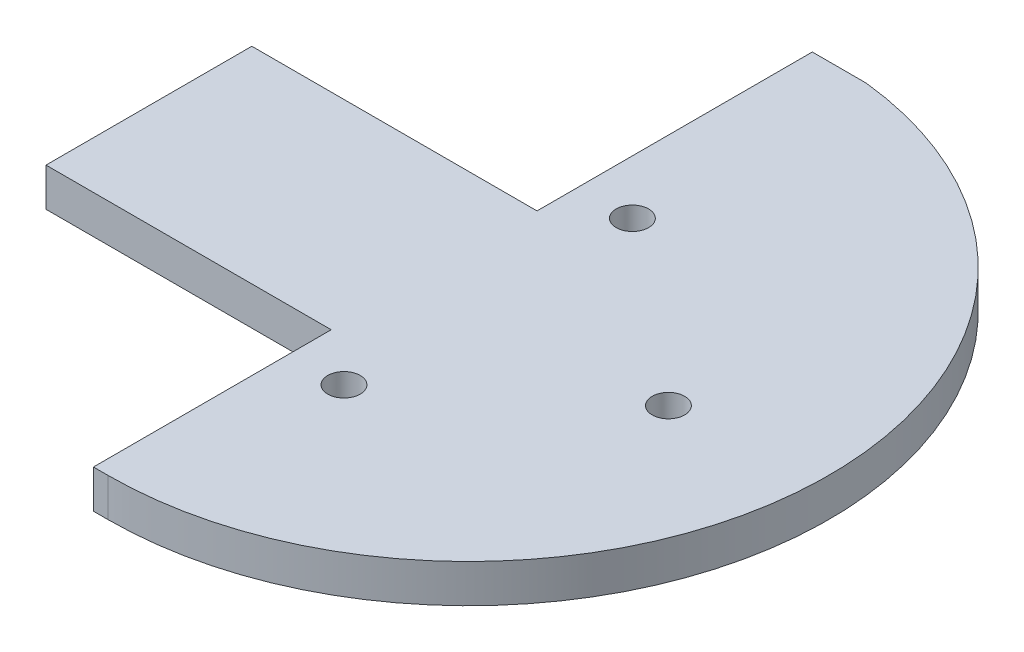
ISO-10303-21;
HEADER;
FILE_DESCRIPTION(('STEP AP214'),'2;1');
FILE_NAME('part.step','',(''),(''),'','','');
FILE_SCHEMA(('AUTOMOTIVE_DESIGN { 1 0 10303 214 1 1 1 1 }'));
ENDSEC;
DATA;
#1=APPLICATION_CONTEXT('core data for automotive mechanical design processes');
#2=APPLICATION_PROTOCOL_DEFINITION('international standard','automotive_design',2000,#1);
#3=PRODUCT_CONTEXT('',#1,'mechanical');
#4=PRODUCT('Part','Part','',(#3));
#5=PRODUCT_RELATED_PRODUCT_CATEGORY('part','',(#4));
#6=PRODUCT_DEFINITION_FORMATION('','',#4);
#7=PRODUCT_DEFINITION_CONTEXT('part definition',#1,'design');
#8=PRODUCT_DEFINITION('design','',#6,#7);
#9=PRODUCT_DEFINITION_SHAPE('','',#8);
#10=(LENGTH_UNIT() NAMED_UNIT(*) SI_UNIT(.MILLI.,.METRE.));
#11=(NAMED_UNIT(*) PLANE_ANGLE_UNIT() SI_UNIT($,.RADIAN.));
#12=(NAMED_UNIT(*) SI_UNIT($,.STERADIAN.) SOLID_ANGLE_UNIT());
#13=UNCERTAINTY_MEASURE_WITH_UNIT(LENGTH_MEASURE(1.E-05),#10,'distance_accuracy_value','');
#14=(GEOMETRIC_REPRESENTATION_CONTEXT(3) GLOBAL_UNCERTAINTY_ASSIGNED_CONTEXT((#13)) GLOBAL_UNIT_ASSIGNED_CONTEXT((#10,
#11,#12)) REPRESENTATION_CONTEXT('',''));
#15=CARTESIAN_POINT('',(0.,0.,0.));
#16=DIRECTION('',(0.,0.,1.));
#17=DIRECTION('',(1.,0.,0.));
#18=AXIS2_PLACEMENT_3D('',#15,#16,#17);
#19=CARTESIAN_POINT('',(-10.3113273390818,2.7,25.2588523972689));
#20=DIRECTION('',(0.,1.,0.));
#21=DIRECTION('',(0.,0.,1.));
#22=AXIS2_PLACEMENT_3D('',#19,#20,#21);
#23=PLANE('',#22);
#24=CARTESIAN_POINT('',(-7.5173273950818,2.7,36.8179765975519));
#25=DIRECTION('',(0.,1.,0.));
#26=DIRECTION('',(0.,0.,1.));
#27=AXIS2_PLACEMENT_3D('',#24,#25,#26);
#28=CIRCLE('',#27,1.143);
#29=CARTESIAN_POINT('',(-7.5173273950818,2.7,35.6749765975519));
#30=VERTEX_POINT('',#29);
#31=EDGE_CURVE('E182',#30,#30,#28,.T.);
#32=ORIENTED_EDGE('',*,*,#31,.F.);
#33=EDGE_LOOP('',(#32));
#34=FACE_BOUND('',#33,.T.);
#35=DIRECTION('',(0.,0.,1.));
#36=VECTOR('',#35,1.);
#37=CARTESIAN_POINT('',(-31.4213273390818,2.7,19.4071007978348));
#38=LINE('',#37,#36);
#39=CARTESIAN_POINT('',(-31.4213273390818,2.7,19.4071007978348));
#40=VERTEX_POINT('',#39);
#41=CARTESIAN_POINT('',(-31.4213273390818,2.7,33.9088523972689));
#42=VERTEX_POINT('',#41);
#43=EDGE_CURVE('E145',#40,#42,#38,.T.);
#44=ORIENTED_EDGE('',*,*,#43,.T.);
#45=DIRECTION('',(1.,0.,0.));
#46=VECTOR('',#45,1.);
#47=CARTESIAN_POINT('',(-31.4213273390818,2.7,33.9088523972689));
#48=LINE('',#47,#46);
#49=CARTESIAN_POINT('',(-11.3273273950818,2.7,33.9088523972689));
#50=VERTEX_POINT('',#49);
#51=EDGE_CURVE('E93',#42,#50,#48,.T.);
#52=ORIENTED_EDGE('',*,*,#51,.T.);
#53=DIRECTION('',(0.,0.,1.));
#54=VECTOR('',#53,1.);
#55=CARTESIAN_POINT('',(-11.3273273950818,2.7,33.9088523972689));
#56=LINE('',#55,#54);
#57=CARTESIAN_POINT('',(-11.3273273950818,2.7,50.6588523972689));
#58=VERTEX_POINT('',#57);
#59=EDGE_CURVE('E160',#50,#58,#56,.T.);
#60=ORIENTED_EDGE('',*,*,#59,.T.);
#61=DIRECTION('',(1.,0.,0.));
#62=VECTOR('',#61,1.);
#63=CARTESIAN_POINT('',(-10.3113273390818,2.7,50.6588523972689));
#64=LINE('',#63,#62);
#65=CARTESIAN_POINT('',(-10.3113273390818,2.7,50.658852397269));
#66=VERTEX_POINT('',#65);
#67=EDGE_CURVE('E173',#58,#66,#64,.T.);
#68=ORIENTED_EDGE('',*,*,#67,.T.);
#69=CARTESIAN_POINT('',(-10.3113273390818,2.7,25.2588523972689));
#70=DIRECTION('',(0.,1.,0.));
#71=DIRECTION('',(0.,0.,1.));
#72=AXIS2_PLACEMENT_3D('',#69,#70,#71);
#73=CIRCLE('',#72,25.4);
#74=CARTESIAN_POINT('',(-7.5173273950818,2.7,0.0129900766245678));
#75=VERTEX_POINT('',#74);
#76=EDGE_CURVE('E112',#66,#75,#73,.T.);
#77=ORIENTED_EDGE('',*,*,#76,.T.);
#78=DIRECTION('',(-1.,0.,0.));
#79=VECTOR('',#78,1.);
#80=CARTESIAN_POINT('',(-7.5173273950818,2.7,0.0129900766245678));
#81=LINE('',#80,#79);
#82=CARTESIAN_POINT('',(-11.3273273950818,2.7,0.0129900766245678));
#83=VERTEX_POINT('',#82);
#84=EDGE_CURVE('E106',#75,#83,#81,.T.);
#85=ORIENTED_EDGE('',*,*,#84,.T.);
#86=DIRECTION('',(0.,0.,1.));
#87=VECTOR('',#86,1.);
#88=CARTESIAN_POINT('',(-11.3273273950818,2.7,0.0129900766245678));
#89=LINE('',#88,#87);
#90=CARTESIAN_POINT('',(-11.3273273950818,2.7,19.4071007978348));
#91=VERTEX_POINT('',#90);
#92=EDGE_CURVE('E110',#83,#91,#89,.T.);
#93=ORIENTED_EDGE('',*,*,#92,.T.);
#94=DIRECTION('',(-1.,0.,0.));
#95=VECTOR('',#94,1.);
#96=CARTESIAN_POINT('',(-31.4213273390818,2.7,19.4071007978348));
#97=LINE('',#96,#95);
#98=EDGE_CURVE('E50',#91,#40,#97,.T.);
#99=ORIENTED_EDGE('',*,*,#98,.T.);
#100=EDGE_LOOP('',(#44,#52,#60,#68,#77,#85,#93,#99));
#101=FACE_BOUND('',#100,.T.);
#102=CARTESIAN_POINT('',(-7.5173273950818,2.7,16.4979765975519));
#103=DIRECTION('',(0.,1.,0.));
#104=DIRECTION('',(0.,0.,1.));
#105=AXIS2_PLACEMENT_3D('',#102,#103,#104);
#106=CIRCLE('',#105,1.143);
#107=CARTESIAN_POINT('',(-7.5173273950818,2.7,15.3549765975519));
#108=VERTEX_POINT('',#107);
#109=EDGE_CURVE('E134',#108,#108,#106,.T.);
#110=ORIENTED_EDGE('',*,*,#109,.F.);
#111=EDGE_LOOP('',(#110));
#112=FACE_BOUND('',#111,.T.);
#113=CARTESIAN_POINT('',(5.1826726049182,2.7,26.6579765975519));
#114=DIRECTION('',(0.,1.,0.));
#115=DIRECTION('',(0.,0.,1.));
#116=AXIS2_PLACEMENT_3D('',#113,#114,#115);
#117=CIRCLE('',#116,1.143);
#118=CARTESIAN_POINT('',(5.1826726049182,2.7,25.5149765975519));
#119=VERTEX_POINT('',#118);
#120=EDGE_CURVE('E188',#119,#119,#117,.T.);
#121=ORIENTED_EDGE('',*,*,#120,.F.);
#122=EDGE_LOOP('',(#121));
#123=FACE_BOUND('',#122,.T.);
#124=ADVANCED_FACE('F33',(#34,#101,#112,#123),#23,.T.);
#125=CARTESIAN_POINT('',(-10.3113273390818,0.,25.2588523972689));
#126=DIRECTION('',(0.,1.,0.));
#127=DIRECTION('',(0.,0.,1.));
#128=AXIS2_PLACEMENT_3D('',#125,#126,#127);
#129=PLANE('',#128);
#130=CARTESIAN_POINT('',(-7.5173273950818,0.,36.8179765975519));
#131=DIRECTION('',(0.,1.,0.));
#132=DIRECTION('',(0.,0.,1.));
#133=AXIS2_PLACEMENT_3D('',#130,#131,#132);
#134=CIRCLE('',#133,1.143);
#135=CARTESIAN_POINT('',(-7.5173273950818,0.,35.6749765975519));
#136=VERTEX_POINT('',#135);
#137=EDGE_CURVE('E185',#136,#136,#134,.T.);
#138=ORIENTED_EDGE('',*,*,#137,.T.);
#139=EDGE_LOOP('',(#138));
#140=FACE_BOUND('',#139,.T.);
#141=DIRECTION('',(0.,0.,1.));
#142=VECTOR('',#141,1.);
#143=CARTESIAN_POINT('',(-31.4213273390818,0.,19.4071007978348));
#144=LINE('',#143,#142);
#145=CARTESIAN_POINT('',(-31.4213273390818,0.,19.4071007978348));
#146=VERTEX_POINT('',#145);
#147=CARTESIAN_POINT('',(-31.4213273390818,0.,33.9088523972689));
#148=VERTEX_POINT('',#147);
#149=EDGE_CURVE('E130',#146,#148,#144,.T.);
#150=ORIENTED_EDGE('',*,*,#149,.F.);
#151=DIRECTION('',(-1.,0.,0.));
#152=VECTOR('',#151,1.);
#153=CARTESIAN_POINT('',(-31.4213273390818,0.,19.4071007978348));
#154=LINE('',#153,#152);
#155=CARTESIAN_POINT('',(-11.3273273950818,0.,19.4071007978348));
#156=VERTEX_POINT('',#155);
#157=EDGE_CURVE('E85',#156,#146,#154,.T.);
#158=ORIENTED_EDGE('',*,*,#157,.F.);
#159=DIRECTION('',(0.,0.,1.));
#160=VECTOR('',#159,1.);
#161=CARTESIAN_POINT('',(-11.3273273950818,0.,0.0129900766245678));
#162=LINE('',#161,#160);
#163=CARTESIAN_POINT('',(-11.3273273950818,0.,0.0129900766245678));
#164=VERTEX_POINT('',#163);
#165=EDGE_CURVE('E79',#164,#156,#162,.T.);
#166=ORIENTED_EDGE('',*,*,#165,.F.);
#167=DIRECTION('',(-1.,0.,0.));
#168=VECTOR('',#167,1.);
#169=CARTESIAN_POINT('',(-7.5173273950818,0.,0.0129900766245678));
#170=LINE('',#169,#168);
#171=CARTESIAN_POINT('',(-7.5173273950818,0.,0.0129900766245678));
#172=VERTEX_POINT('',#171);
#173=EDGE_CURVE('E120',#172,#164,#170,.T.);
#174=ORIENTED_EDGE('',*,*,#173,.F.);
#175=CARTESIAN_POINT('',(-10.3113273390818,0.,25.2588523972689));
#176=DIRECTION('',(0.,1.,0.));
#177=DIRECTION('',(0.,0.,1.));
#178=AXIS2_PLACEMENT_3D('',#175,#176,#177);
#179=CIRCLE('',#178,25.4);
#180=CARTESIAN_POINT('',(-10.3113273390818,0.,50.658852397269));
#181=VERTEX_POINT('',#180);
#182=EDGE_CURVE('E140',#181,#172,#179,.T.);
#183=ORIENTED_EDGE('',*,*,#182,.F.);
#184=DIRECTION('',(1.,0.,0.));
#185=VECTOR('',#184,1.);
#186=CARTESIAN_POINT('',(-10.3113273390818,0.,50.6588523972689));
#187=LINE('',#186,#185);
#188=CARTESIAN_POINT('',(-11.3273273950818,0.,50.6588523972689));
#189=VERTEX_POINT('',#188);
#190=EDGE_CURVE('E138',#189,#181,#187,.T.);
#191=ORIENTED_EDGE('',*,*,#190,.F.);
#192=DIRECTION('',(0.,0.,1.));
#193=VECTOR('',#192,1.);
#194=CARTESIAN_POINT('',(-11.3273273950818,0.,33.9088523972689));
#195=LINE('',#194,#193);
#196=CARTESIAN_POINT('',(-11.3273273950818,0.,33.9088523972689));
#197=VERTEX_POINT('',#196);
#198=EDGE_CURVE('E136',#197,#189,#195,.T.);
#199=ORIENTED_EDGE('',*,*,#198,.F.);
#200=DIRECTION('',(1.,0.,0.));
#201=VECTOR('',#200,1.);
#202=CARTESIAN_POINT('',(-31.4213273390818,0.,33.9088523972689));
#203=LINE('',#202,#201);
#204=EDGE_CURVE('E133',#148,#197,#203,.T.);
#205=ORIENTED_EDGE('',*,*,#204,.F.);
#206=EDGE_LOOP('',(#150,#158,#166,#174,#183,#191,#199,#205));
#207=FACE_BOUND('',#206,.T.);
#208=CARTESIAN_POINT('',(-7.5173273950818,0.,16.4979765975519));
#209=DIRECTION('',(0.,1.,0.));
#210=DIRECTION('',(0.,0.,1.));
#211=AXIS2_PLACEMENT_3D('',#208,#209,#210);
#212=CIRCLE('',#211,1.143);
#213=CARTESIAN_POINT('',(-7.5173273950818,0.,15.3549765975519));
#214=VERTEX_POINT('',#213);
#215=EDGE_CURVE('E179',#214,#214,#212,.T.);
#216=ORIENTED_EDGE('',*,*,#215,.T.);
#217=EDGE_LOOP('',(#216));
#218=FACE_BOUND('',#217,.T.);
#219=CARTESIAN_POINT('',(5.1826726049182,0.,26.6579765975519));
#220=DIRECTION('',(0.,1.,0.));
#221=DIRECTION('',(0.,0.,1.));
#222=AXIS2_PLACEMENT_3D('',#219,#220,#221);
#223=CIRCLE('',#222,1.143);
#224=CARTESIAN_POINT('',(5.1826726049182,0.,25.5149765975519));
#225=VERTEX_POINT('',#224);
#226=EDGE_CURVE('E191',#225,#225,#223,.T.);
#227=ORIENTED_EDGE('',*,*,#226,.T.);
#228=EDGE_LOOP('',(#227));
#229=FACE_BOUND('',#228,.T.);
#230=ADVANCED_FACE('F164',(#140,#207,#218,#229),#129,.F.);
#231=CARTESIAN_POINT('',(-31.4213273390818,2.7,19.4071007978348));
#232=DIRECTION('',(1.,0.,0.));
#233=DIRECTION('',(0.,0.,-1.));
#234=AXIS2_PLACEMENT_3D('',#231,#232,#233);
#235=PLANE('',#234);
#236=ORIENTED_EDGE('',*,*,#149,.T.);
#237=DIRECTION('',(0.,-1.,0.));
#238=VECTOR('',#237,1.);
#239=CARTESIAN_POINT('',(-31.4213273390818,2.7,33.9088523972689));
#240=LINE('',#239,#238);
#241=EDGE_CURVE('E11',#42,#148,#240,.T.);
#242=ORIENTED_EDGE('',*,*,#241,.F.);
#243=ORIENTED_EDGE('',*,*,#43,.F.);
#244=DIRECTION('',(0.,-1.,0.));
#245=VECTOR('',#244,1.);
#246=CARTESIAN_POINT('',(-31.4213273390818,2.7,19.4071007978348));
#247=LINE('',#246,#245);
#248=EDGE_CURVE('E126',#40,#146,#247,.T.);
#249=ORIENTED_EDGE('',*,*,#248,.T.);
#250=EDGE_LOOP('',(#236,#242,#243,#249));
#251=FACE_BOUND('',#250,.T.);
#252=ADVANCED_FACE('F35',(#251),#235,.F.);
#253=CARTESIAN_POINT('',(-31.4213273390818,2.7,33.9088523972689));
#254=DIRECTION('',(0.,0.,-1.));
#255=DIRECTION('',(-1.,0.,0.));
#256=AXIS2_PLACEMENT_3D('',#253,#254,#255);
#257=PLANE('',#256);
#258=ORIENTED_EDGE('',*,*,#204,.T.);
#259=DIRECTION('',(0.,-1.,0.));
#260=VECTOR('',#259,1.);
#261=CARTESIAN_POINT('',(-11.3273273950818,2.7,33.9088523972689));
#262=LINE('',#261,#260);
#263=EDGE_CURVE('E42',#50,#197,#262,.T.);
#264=ORIENTED_EDGE('',*,*,#263,.F.);
#265=ORIENTED_EDGE('',*,*,#51,.F.);
#266=ORIENTED_EDGE('',*,*,#241,.T.);
#267=EDGE_LOOP('',(#258,#264,#265,#266));
#268=FACE_BOUND('',#267,.T.);
#269=ADVANCED_FACE('F225',(#268),#257,.F.);
#270=CARTESIAN_POINT('',(-11.3273273950818,2.7,33.9088523972689));
#271=DIRECTION('',(1.,0.,0.));
#272=DIRECTION('',(0.,0.,-1.));
#273=AXIS2_PLACEMENT_3D('',#270,#271,#272);
#274=PLANE('',#273);
#275=ORIENTED_EDGE('',*,*,#198,.T.);
#276=DIRECTION('',(0.,-1.,0.));
#277=VECTOR('',#276,1.);
#278=CARTESIAN_POINT('',(-11.3273273950818,2.7,50.6588523972689));
#279=LINE('',#278,#277);
#280=EDGE_CURVE('E152',#58,#189,#279,.T.);
#281=ORIENTED_EDGE('',*,*,#280,.F.);
#282=ORIENTED_EDGE('',*,*,#59,.F.);
#283=ORIENTED_EDGE('',*,*,#263,.T.);
#284=EDGE_LOOP('',(#275,#281,#282,#283));
#285=FACE_BOUND('',#284,.T.);
#286=ADVANCED_FACE('F158',(#285),#274,.F.);
#287=CARTESIAN_POINT('',(-10.3113273390818,2.7,50.6588523972689));
#288=DIRECTION('',(0.,0.,-1.));
#289=DIRECTION('',(-1.,0.,0.));
#290=AXIS2_PLACEMENT_3D('',#287,#288,#289);
#291=PLANE('',#290);
#292=ORIENTED_EDGE('',*,*,#190,.T.);
#293=DIRECTION('',(0.,-1.,0.));
#294=VECTOR('',#293,1.);
#295=CARTESIAN_POINT('',(-10.3113273390818,2.7,50.658852397269));
#296=LINE('',#295,#294);
#297=EDGE_CURVE('E149',#66,#181,#296,.T.);
#298=ORIENTED_EDGE('',*,*,#297,.F.);
#299=ORIENTED_EDGE('',*,*,#67,.F.);
#300=ORIENTED_EDGE('',*,*,#280,.T.);
#301=EDGE_LOOP('',(#292,#298,#299,#300));
#302=FACE_BOUND('',#301,.T.);
#303=ADVANCED_FACE('F169',(#302),#291,.F.);
#304=CARTESIAN_POINT('',(-10.3113273390818,2.7,25.2588523972689));
#305=DIRECTION('',(0.,-1.,0.));
#306=DIRECTION('',(0.,0.,-1.));
#307=AXIS2_PLACEMENT_3D('',#304,#305,#306);
#308=CYLINDRICAL_SURFACE('',#307,25.4);
#309=ORIENTED_EDGE('',*,*,#182,.T.);
#310=DIRECTION('',(0.,-1.,0.));
#311=VECTOR('',#310,1.);
#312=CARTESIAN_POINT('',(-7.5173273950818,2.7,0.0129900766245678));
#313=LINE('',#312,#311);
#314=EDGE_CURVE('E121',#75,#172,#313,.T.);
#315=ORIENTED_EDGE('',*,*,#314,.F.);
#316=ORIENTED_EDGE('',*,*,#76,.F.);
#317=ORIENTED_EDGE('',*,*,#297,.T.);
#318=EDGE_LOOP('',(#309,#315,#316,#317));
#319=FACE_BOUND('',#318,.T.);
#320=ADVANCED_FACE('F172',(#319),#308,.T.);
#321=CARTESIAN_POINT('',(-7.5173273950818,2.7,0.0129900766245678));
#322=DIRECTION('',(0.,0.,1.));
#323=DIRECTION('',(1.,0.,0.));
#324=AXIS2_PLACEMENT_3D('',#321,#322,#323);
#325=PLANE('',#324);
#326=ORIENTED_EDGE('',*,*,#173,.T.);
#327=DIRECTION('',(0.,-1.,0.));
#328=VECTOR('',#327,1.);
#329=CARTESIAN_POINT('',(-11.3273273950818,2.7,0.0129900766245678));
#330=LINE('',#329,#328);
#331=EDGE_CURVE('E117',#83,#164,#330,.T.);
#332=ORIENTED_EDGE('',*,*,#331,.F.);
#333=ORIENTED_EDGE('',*,*,#84,.F.);
#334=ORIENTED_EDGE('',*,*,#314,.T.);
#335=EDGE_LOOP('',(#326,#332,#333,#334));
#336=FACE_BOUND('',#335,.T.);
#337=ADVANCED_FACE('F118',(#336),#325,.F.);
#338=CARTESIAN_POINT('',(-11.3273273950818,2.7,0.0129900766245678));
#339=DIRECTION('',(1.,0.,0.));
#340=DIRECTION('',(0.,0.,-1.));
#341=AXIS2_PLACEMENT_3D('',#338,#339,#340);
#342=PLANE('',#341);
#343=ORIENTED_EDGE('',*,*,#165,.T.);
#344=DIRECTION('',(0.,-1.,0.));
#345=VECTOR('',#344,1.);
#346=CARTESIAN_POINT('',(-11.3273273950818,2.7,19.4071007978348));
#347=LINE('',#346,#345);
#348=EDGE_CURVE('E122',#91,#156,#347,.T.);
#349=ORIENTED_EDGE('',*,*,#348,.F.);
#350=ORIENTED_EDGE('',*,*,#92,.F.);
#351=ORIENTED_EDGE('',*,*,#331,.T.);
#352=EDGE_LOOP('',(#343,#349,#350,#351));
#353=FACE_BOUND('',#352,.T.);
#354=ADVANCED_FACE('F124',(#353),#342,.F.);
#355=CARTESIAN_POINT('',(-31.4213273390818,2.7,19.4071007978348));
#356=DIRECTION('',(0.,0.,1.));
#357=DIRECTION('',(1.,0.,0.));
#358=AXIS2_PLACEMENT_3D('',#355,#356,#357);
#359=PLANE('',#358);
#360=ORIENTED_EDGE('',*,*,#157,.T.);
#361=ORIENTED_EDGE('',*,*,#248,.F.);
#362=ORIENTED_EDGE('',*,*,#98,.F.);
#363=ORIENTED_EDGE('',*,*,#348,.T.);
#364=EDGE_LOOP('',(#360,#361,#362,#363));
#365=FACE_BOUND('',#364,.T.);
#366=ADVANCED_FACE('F213',(#365),#359,.F.);
#367=CARTESIAN_POINT('',(-7.5173273950818,2.7,16.4979765975519));
#368=DIRECTION('',(0.,-1.,0.));
#369=DIRECTION('',(0.,0.,-1.));
#370=AXIS2_PLACEMENT_3D('',#367,#368,#369);
#371=CYLINDRICAL_SURFACE('',#370,1.143);
#372=CARTESIAN_POINT('',(-7.5173273950818,2.7,15.3549765975519));
#373=CARTESIAN_POINT('',(-7.5173273950818,2.671875,15.3549765975519));
#374=CARTESIAN_POINT('',(-7.5173273950818,2.64375,15.3549765975519));
#375=CARTESIAN_POINT('',(-7.5173273950818,2.5875,15.3549765975519));
#376=CARTESIAN_POINT('',(-7.5173273950818,2.559375,15.3549765975519));
#377=CARTESIAN_POINT('',(-7.5173273950818,2.503125,15.3549765975519));
#378=CARTESIAN_POINT('',(-7.5173273950818,2.475,15.3549765975519));
#379=CARTESIAN_POINT('',(-7.5173273950818,2.41875,15.3549765975519));
#380=CARTESIAN_POINT('',(-7.5173273950818,2.390625,15.3549765975519));
#381=CARTESIAN_POINT('',(-7.5173273950818,2.334375,15.3549765975519));
#382=CARTESIAN_POINT('',(-7.5173273950818,2.30625,15.3549765975519));
#383=CARTESIAN_POINT('',(-7.5173273950818,2.25,15.3549765975519));
#384=CARTESIAN_POINT('',(-7.5173273950818,2.221875,15.3549765975519));
#385=CARTESIAN_POINT('',(-7.5173273950818,2.165625,15.3549765975519));
#386=CARTESIAN_POINT('',(-7.5173273950818,2.1375,15.3549765975519));
#387=CARTESIAN_POINT('',(-7.5173273950818,2.08125,15.3549765975519));
#388=CARTESIAN_POINT('',(-7.5173273950818,2.053125,15.3549765975519));
#389=CARTESIAN_POINT('',(-7.5173273950818,1.996875,15.3549765975519));
#390=CARTESIAN_POINT('',(-7.5173273950818,1.96875,15.3549765975519));
#391=CARTESIAN_POINT('',(-7.5173273950818,1.9125,15.3549765975519));
#392=CARTESIAN_POINT('',(-7.5173273950818,1.884375,15.3549765975519));
#393=CARTESIAN_POINT('',(-7.5173273950818,1.828125,15.3549765975519));
#394=CARTESIAN_POINT('',(-7.5173273950818,1.8,15.3549765975519));
#395=CARTESIAN_POINT('',(-7.5173273950818,1.74375,15.3549765975519));
#396=CARTESIAN_POINT('',(-7.5173273950818,1.715625,15.3549765975519));
#397=CARTESIAN_POINT('',(-7.5173273950818,1.659375,15.3549765975519));
#398=CARTESIAN_POINT('',(-7.5173273950818,1.63125,15.3549765975519));
#399=CARTESIAN_POINT('',(-7.5173273950818,1.575,15.3549765975519));
#400=CARTESIAN_POINT('',(-7.5173273950818,1.546875,15.3549765975519));
#401=CARTESIAN_POINT('',(-7.5173273950818,1.490625,15.3549765975519));
#402=CARTESIAN_POINT('',(-7.5173273950818,1.4625,15.3549765975519));
#403=CARTESIAN_POINT('',(-7.5173273950818,1.40625,15.3549765975519));
#404=CARTESIAN_POINT('',(-7.5173273950818,1.378125,15.3549765975519));
#405=CARTESIAN_POINT('',(-7.5173273950818,1.321875,15.3549765975519));
#406=CARTESIAN_POINT('',(-7.5173273950818,1.29375,15.3549765975519));
#407=CARTESIAN_POINT('',(-7.5173273950818,1.2375,15.3549765975519));
#408=CARTESIAN_POINT('',(-7.5173273950818,1.209375,15.3549765975519));
#409=CARTESIAN_POINT('',(-7.5173273950818,1.153125,15.3549765975519));
#410=CARTESIAN_POINT('',(-7.5173273950818,1.125,15.3549765975519));
#411=CARTESIAN_POINT('',(-7.5173273950818,1.06875,15.3549765975519));
#412=CARTESIAN_POINT('',(-7.5173273950818,1.040625,15.3549765975519));
#413=CARTESIAN_POINT('',(-7.5173273950818,0.984375,15.3549765975519));
#414=CARTESIAN_POINT('',(-7.5173273950818,0.956249999999999,15.3549765975519));
#415=CARTESIAN_POINT('',(-7.5173273950818,0.899999999999999,15.3549765975519));
#416=CARTESIAN_POINT('',(-7.5173273950818,0.871875,15.3549765975519));
#417=CARTESIAN_POINT('',(-7.5173273950818,0.815624999999999,15.3549765975519));
#418=CARTESIAN_POINT('',(-7.5173273950818,0.787499999999999,15.3549765975519));
#419=CARTESIAN_POINT('',(-7.5173273950818,0.73125,15.3549765975519));
#420=CARTESIAN_POINT('',(-7.5173273950818,0.703125,15.3549765975519));
#421=CARTESIAN_POINT('',(-7.5173273950818,0.646875,15.3549765975519));
#422=CARTESIAN_POINT('',(-7.5173273950818,0.61875,15.3549765975519));
#423=CARTESIAN_POINT('',(-7.5173273950818,0.5625,15.3549765975519));
#424=CARTESIAN_POINT('',(-7.5173273950818,0.534375,15.3549765975519));
#425=CARTESIAN_POINT('',(-7.5173273950818,0.478125,15.3549765975519));
#426=CARTESIAN_POINT('',(-7.5173273950818,0.45,15.3549765975519));
#427=CARTESIAN_POINT('',(-7.5173273950818,0.39375,15.3549765975519));
#428=CARTESIAN_POINT('',(-7.5173273950818,0.365625,15.3549765975519));
#429=CARTESIAN_POINT('',(-7.5173273950818,0.309375,15.3549765975519));
#430=CARTESIAN_POINT('',(-7.5173273950818,0.28125,15.3549765975519));
#431=CARTESIAN_POINT('',(-7.5173273950818,0.225,15.3549765975519));
#432=CARTESIAN_POINT('',(-7.5173273950818,0.196875,15.3549765975519));
#433=CARTESIAN_POINT('',(-7.5173273950818,0.140625,15.3549765975519));
#434=CARTESIAN_POINT('',(-7.5173273950818,0.1125,15.3549765975519));
#435=CARTESIAN_POINT('',(-7.5173273950818,0.0562499999999997,15.3549765975519));
#436=CARTESIAN_POINT('',(-7.5173273950818,0.0281249999999996,15.3549765975519));
#437=CARTESIAN_POINT('',(-7.5173273950818,0.,15.3549765975519));
#438=B_SPLINE_CURVE_WITH_KNOTS('',3,(#372,#373,#374,#375,#376,#377,#378,#379,#380,#381,#382,
#383,#384,#385,#386,#387,#388,#389,#390,#391,#392,#393,#394,#395,#396,#397,#398,#399,#400,#401,
#402,#403,#404,#405,#406,#407,#408,#409,#410,#411,#412,#413,#414,#415,#416,#417,#418,#419,#420,
#421,#422,#423,#424,#425,#426,#427,#428,#429,#430,#431,#432,#433,#434,#435,#436,#437),
.UNSPECIFIED.,.F.,.F.,(4,2,2,2,2,2,2,2,2,2,2,2,2,2,2,2,2,2,2,2,2,2,2,2,2,2,2,2,2,2,2,2,4),(0.,
0.0843750000000003,0.16875,0.253125,0.3375,0.421875,0.50625,0.590625,0.675,0.759375,0.84375,
0.928125000000001,1.0125,1.096875,1.18125,1.265625,1.35,1.434375,1.51875,1.603125,1.6875,
1.771875,1.85625,1.940625,2.025,2.109375,2.19375,2.278125,2.3625,2.446875,2.53125,2.615625,2.7),.UNSPECIFIED.);
#439=EDGE_CURVE('BSEAM210',#108,#214,#438,.T.);
#440=ORIENTED_EDGE('',*,*,#109,.T.);
#441=ORIENTED_EDGE('',*,*,#215,.F.);
#442=ORIENTED_EDGE('',*,*,#439,.T.);
#443=ORIENTED_EDGE('',*,*,#439,.F.);
#444=EDGE_LOOP('',(#440,#442,#441,#443));
#445=FACE_BOUND('',#444,.T.);
#446=ADVANCED_FACE('F210',(#445),#371,.F.);
#447=CARTESIAN_POINT('',(-7.5173273950818,2.7,36.8179765975519));
#448=DIRECTION('',(0.,-1.,0.));
#449=DIRECTION('',(0.,0.,-1.));
#450=AXIS2_PLACEMENT_3D('',#447,#448,#449);
#451=CYLINDRICAL_SURFACE('',#450,1.143);
#452=CARTESIAN_POINT('',(-7.5173273950818,2.7,35.6749765975519));
#453=CARTESIAN_POINT('',(-7.5173273950818,2.671875,35.6749765975519));
#454=CARTESIAN_POINT('',(-7.5173273950818,2.64375,35.6749765975519));
#455=CARTESIAN_POINT('',(-7.5173273950818,2.5875,35.6749765975519));
#456=CARTESIAN_POINT('',(-7.5173273950818,2.559375,35.6749765975519));
#457=CARTESIAN_POINT('',(-7.5173273950818,2.503125,35.6749765975519));
#458=CARTESIAN_POINT('',(-7.5173273950818,2.475,35.6749765975519));
#459=CARTESIAN_POINT('',(-7.5173273950818,2.41875,35.6749765975519));
#460=CARTESIAN_POINT('',(-7.5173273950818,2.390625,35.6749765975519));
#461=CARTESIAN_POINT('',(-7.5173273950818,2.334375,35.6749765975519));
#462=CARTESIAN_POINT('',(-7.5173273950818,2.30625,35.6749765975519));
#463=CARTESIAN_POINT('',(-7.5173273950818,2.25,35.6749765975519));
#464=CARTESIAN_POINT('',(-7.5173273950818,2.221875,35.6749765975519));
#465=CARTESIAN_POINT('',(-7.5173273950818,2.165625,35.6749765975519));
#466=CARTESIAN_POINT('',(-7.5173273950818,2.1375,35.6749765975519));
#467=CARTESIAN_POINT('',(-7.5173273950818,2.08125,35.6749765975519));
#468=CARTESIAN_POINT('',(-7.5173273950818,2.053125,35.6749765975519));
#469=CARTESIAN_POINT('',(-7.5173273950818,1.996875,35.6749765975519));
#470=CARTESIAN_POINT('',(-7.5173273950818,1.96875,35.6749765975519));
#471=CARTESIAN_POINT('',(-7.5173273950818,1.9125,35.6749765975519));
#472=CARTESIAN_POINT('',(-7.5173273950818,1.884375,35.6749765975519));
#473=CARTESIAN_POINT('',(-7.5173273950818,1.828125,35.6749765975519));
#474=CARTESIAN_POINT('',(-7.5173273950818,1.8,35.6749765975519));
#475=CARTESIAN_POINT('',(-7.5173273950818,1.74375,35.6749765975519));
#476=CARTESIAN_POINT('',(-7.5173273950818,1.715625,35.6749765975519));
#477=CARTESIAN_POINT('',(-7.5173273950818,1.659375,35.6749765975519));
#478=CARTESIAN_POINT('',(-7.5173273950818,1.63125,35.6749765975519));
#479=CARTESIAN_POINT('',(-7.5173273950818,1.575,35.6749765975519));
#480=CARTESIAN_POINT('',(-7.5173273950818,1.546875,35.6749765975519));
#481=CARTESIAN_POINT('',(-7.5173273950818,1.490625,35.6749765975519));
#482=CARTESIAN_POINT('',(-7.5173273950818,1.4625,35.6749765975519));
#483=CARTESIAN_POINT('',(-7.5173273950818,1.40625,35.6749765975519));
#484=CARTESIAN_POINT('',(-7.5173273950818,1.378125,35.6749765975519));
#485=CARTESIAN_POINT('',(-7.5173273950818,1.321875,35.6749765975519));
#486=CARTESIAN_POINT('',(-7.5173273950818,1.29375,35.6749765975519));
#487=CARTESIAN_POINT('',(-7.5173273950818,1.2375,35.6749765975519));
#488=CARTESIAN_POINT('',(-7.5173273950818,1.209375,35.6749765975519));
#489=CARTESIAN_POINT('',(-7.5173273950818,1.153125,35.6749765975519));
#490=CARTESIAN_POINT('',(-7.5173273950818,1.125,35.6749765975519));
#491=CARTESIAN_POINT('',(-7.5173273950818,1.06875,35.6749765975519));
#492=CARTESIAN_POINT('',(-7.5173273950818,1.040625,35.6749765975519));
#493=CARTESIAN_POINT('',(-7.5173273950818,0.984375,35.6749765975519));
#494=CARTESIAN_POINT('',(-7.5173273950818,0.956249999999999,35.6749765975519));
#495=CARTESIAN_POINT('',(-7.5173273950818,0.899999999999999,35.6749765975519));
#496=CARTESIAN_POINT('',(-7.5173273950818,0.871875,35.6749765975519));
#497=CARTESIAN_POINT('',(-7.5173273950818,0.815624999999999,35.6749765975519));
#498=CARTESIAN_POINT('',(-7.5173273950818,0.787499999999999,35.6749765975519));
#499=CARTESIAN_POINT('',(-7.5173273950818,0.73125,35.6749765975519));
#500=CARTESIAN_POINT('',(-7.5173273950818,0.703125,35.6749765975519));
#501=CARTESIAN_POINT('',(-7.5173273950818,0.646875,35.6749765975519));
#502=CARTESIAN_POINT('',(-7.5173273950818,0.61875,35.6749765975519));
#503=CARTESIAN_POINT('',(-7.5173273950818,0.5625,35.6749765975519));
#504=CARTESIAN_POINT('',(-7.5173273950818,0.534375,35.6749765975519));
#505=CARTESIAN_POINT('',(-7.5173273950818,0.478125,35.6749765975519));
#506=CARTESIAN_POINT('',(-7.5173273950818,0.45,35.6749765975519));
#507=CARTESIAN_POINT('',(-7.5173273950818,0.39375,35.6749765975519));
#508=CARTESIAN_POINT('',(-7.5173273950818,0.365625,35.6749765975519));
#509=CARTESIAN_POINT('',(-7.5173273950818,0.309375,35.6749765975519));
#510=CARTESIAN_POINT('',(-7.5173273950818,0.28125,35.6749765975519));
#511=CARTESIAN_POINT('',(-7.5173273950818,0.225,35.6749765975519));
#512=CARTESIAN_POINT('',(-7.5173273950818,0.196875,35.6749765975519));
#513=CARTESIAN_POINT('',(-7.5173273950818,0.140625,35.6749765975519));
#514=CARTESIAN_POINT('',(-7.5173273950818,0.1125,35.6749765975519));
#515=CARTESIAN_POINT('',(-7.5173273950818,0.0562499999999997,35.6749765975519));
#516=CARTESIAN_POINT('',(-7.5173273950818,0.0281249999999996,35.6749765975519));
#517=CARTESIAN_POINT('',(-7.5173273950818,0.,35.6749765975519));
#518=B_SPLINE_CURVE_WITH_KNOTS('',3,(#452,#453,#454,#455,#456,#457,#458,#459,#460,#461,#462,
#463,#464,#465,#466,#467,#468,#469,#470,#471,#472,#473,#474,#475,#476,#477,#478,#479,#480,#481,
#482,#483,#484,#485,#486,#487,#488,#489,#490,#491,#492,#493,#494,#495,#496,#497,#498,#499,#500,
#501,#502,#503,#504,#505,#506,#507,#508,#509,#510,#511,#512,#513,#514,#515,#516,#517),
.UNSPECIFIED.,.F.,.F.,(4,2,2,2,2,2,2,2,2,2,2,2,2,2,2,2,2,2,2,2,2,2,2,2,2,2,2,2,2,2,2,2,4),(0.,
0.0843750000000003,0.16875,0.253125,0.3375,0.421875,0.50625,0.590625,0.675,0.759375,0.84375,
0.928125000000001,1.0125,1.096875,1.18125,1.265625,1.35,1.434375,1.51875,1.603125,1.6875,
1.771875,1.85625,1.940625,2.025,2.109375,2.19375,2.278125,2.3625,2.446875,2.53125,2.615625,2.7),.UNSPECIFIED.);
#519=EDGE_CURVE('BSEAM289',#30,#136,#518,.T.);
#520=ORIENTED_EDGE('',*,*,#31,.T.);
#521=ORIENTED_EDGE('',*,*,#137,.F.);
#522=ORIENTED_EDGE('',*,*,#519,.T.);
#523=ORIENTED_EDGE('',*,*,#519,.F.);
#524=EDGE_LOOP('',(#520,#522,#521,#523));
#525=FACE_BOUND('',#524,.T.);
#526=ADVANCED_FACE('F289',(#525),#451,.F.);
#527=CARTESIAN_POINT('',(5.1826726049182,2.7,26.6579765975519));
#528=DIRECTION('',(0.,-1.,0.));
#529=DIRECTION('',(0.,0.,-1.));
#530=AXIS2_PLACEMENT_3D('',#527,#528,#529);
#531=CYLINDRICAL_SURFACE('',#530,1.143);
#532=CARTESIAN_POINT('',(5.1826726049182,2.7,25.5149765975519));
#533=CARTESIAN_POINT('',(5.1826726049182,2.671875,25.5149765975519));
#534=CARTESIAN_POINT('',(5.1826726049182,2.64375,25.5149765975519));
#535=CARTESIAN_POINT('',(5.1826726049182,2.5875,25.5149765975519));
#536=CARTESIAN_POINT('',(5.1826726049182,2.559375,25.5149765975519));
#537=CARTESIAN_POINT('',(5.1826726049182,2.503125,25.5149765975519));
#538=CARTESIAN_POINT('',(5.1826726049182,2.475,25.5149765975519));
#539=CARTESIAN_POINT('',(5.1826726049182,2.41875,25.5149765975519));
#540=CARTESIAN_POINT('',(5.1826726049182,2.390625,25.5149765975519));
#541=CARTESIAN_POINT('',(5.1826726049182,2.334375,25.5149765975519));
#542=CARTESIAN_POINT('',(5.1826726049182,2.30625,25.5149765975519));
#543=CARTESIAN_POINT('',(5.1826726049182,2.25,25.5149765975519));
#544=CARTESIAN_POINT('',(5.1826726049182,2.221875,25.5149765975519));
#545=CARTESIAN_POINT('',(5.1826726049182,2.165625,25.5149765975519));
#546=CARTESIAN_POINT('',(5.1826726049182,2.1375,25.5149765975519));
#547=CARTESIAN_POINT('',(5.1826726049182,2.08125,25.5149765975519));
#548=CARTESIAN_POINT('',(5.1826726049182,2.053125,25.5149765975519));
#549=CARTESIAN_POINT('',(5.1826726049182,1.996875,25.5149765975519));
#550=CARTESIAN_POINT('',(5.1826726049182,1.96875,25.5149765975519));
#551=CARTESIAN_POINT('',(5.1826726049182,1.9125,25.5149765975519));
#552=CARTESIAN_POINT('',(5.1826726049182,1.884375,25.5149765975519));
#553=CARTESIAN_POINT('',(5.1826726049182,1.828125,25.5149765975519));
#554=CARTESIAN_POINT('',(5.1826726049182,1.8,25.5149765975519));
#555=CARTESIAN_POINT('',(5.1826726049182,1.74375,25.5149765975519));
#556=CARTESIAN_POINT('',(5.1826726049182,1.715625,25.5149765975519));
#557=CARTESIAN_POINT('',(5.1826726049182,1.659375,25.5149765975519));
#558=CARTESIAN_POINT('',(5.1826726049182,1.63125,25.5149765975519));
#559=CARTESIAN_POINT('',(5.1826726049182,1.575,25.5149765975519));
#560=CARTESIAN_POINT('',(5.1826726049182,1.546875,25.5149765975519));
#561=CARTESIAN_POINT('',(5.1826726049182,1.490625,25.5149765975519));
#562=CARTESIAN_POINT('',(5.1826726049182,1.4625,25.5149765975519));
#563=CARTESIAN_POINT('',(5.1826726049182,1.40625,25.5149765975519));
#564=CARTESIAN_POINT('',(5.1826726049182,1.378125,25.5149765975519));
#565=CARTESIAN_POINT('',(5.1826726049182,1.321875,25.5149765975519));
#566=CARTESIAN_POINT('',(5.1826726049182,1.29375,25.5149765975519));
#567=CARTESIAN_POINT('',(5.1826726049182,1.2375,25.5149765975519));
#568=CARTESIAN_POINT('',(5.1826726049182,1.209375,25.5149765975519));
#569=CARTESIAN_POINT('',(5.1826726049182,1.153125,25.5149765975519));
#570=CARTESIAN_POINT('',(5.1826726049182,1.125,25.5149765975519));
#571=CARTESIAN_POINT('',(5.1826726049182,1.06875,25.5149765975519));
#572=CARTESIAN_POINT('',(5.1826726049182,1.040625,25.5149765975519));
#573=CARTESIAN_POINT('',(5.1826726049182,0.984375,25.5149765975519));
#574=CARTESIAN_POINT('',(5.1826726049182,0.956249999999999,25.5149765975519));
#575=CARTESIAN_POINT('',(5.1826726049182,0.899999999999999,25.5149765975519));
#576=CARTESIAN_POINT('',(5.1826726049182,0.871875,25.5149765975519));
#577=CARTESIAN_POINT('',(5.1826726049182,0.815624999999999,25.5149765975519));
#578=CARTESIAN_POINT('',(5.1826726049182,0.787499999999999,25.5149765975519));
#579=CARTESIAN_POINT('',(5.1826726049182,0.73125,25.5149765975519));
#580=CARTESIAN_POINT('',(5.1826726049182,0.703125,25.5149765975519));
#581=CARTESIAN_POINT('',(5.1826726049182,0.646875,25.5149765975519));
#582=CARTESIAN_POINT('',(5.1826726049182,0.61875,25.5149765975519));
#583=CARTESIAN_POINT('',(5.1826726049182,0.5625,25.5149765975519));
#584=CARTESIAN_POINT('',(5.1826726049182,0.534375,25.5149765975519));
#585=CARTESIAN_POINT('',(5.1826726049182,0.478125,25.5149765975519));
#586=CARTESIAN_POINT('',(5.1826726049182,0.45,25.5149765975519));
#587=CARTESIAN_POINT('',(5.1826726049182,0.39375,25.5149765975519));
#588=CARTESIAN_POINT('',(5.1826726049182,0.365625,25.5149765975519));
#589=CARTESIAN_POINT('',(5.1826726049182,0.309375,25.5149765975519));
#590=CARTESIAN_POINT('',(5.1826726049182,0.28125,25.5149765975519));
#591=CARTESIAN_POINT('',(5.1826726049182,0.225,25.5149765975519));
#592=CARTESIAN_POINT('',(5.1826726049182,0.196875,25.5149765975519));
#593=CARTESIAN_POINT('',(5.1826726049182,0.140625,25.5149765975519));
#594=CARTESIAN_POINT('',(5.1826726049182,0.1125,25.5149765975519));
#595=CARTESIAN_POINT('',(5.1826726049182,0.0562499999999997,25.5149765975519));
#596=CARTESIAN_POINT('',(5.1826726049182,0.0281249999999996,25.5149765975519));
#597=CARTESIAN_POINT('',(5.1826726049182,0.,25.5149765975519));
#598=B_SPLINE_CURVE_WITH_KNOTS('',3,(#532,#533,#534,#535,#536,#537,#538,#539,#540,#541,#542,
#543,#544,#545,#546,#547,#548,#549,#550,#551,#552,#553,#554,#555,#556,#557,#558,#559,#560,#561,
#562,#563,#564,#565,#566,#567,#568,#569,#570,#571,#572,#573,#574,#575,#576,#577,#578,#579,#580,
#581,#582,#583,#584,#585,#586,#587,#588,#589,#590,#591,#592,#593,#594,#595,#596,#597),
.UNSPECIFIED.,.F.,.F.,(4,2,2,2,2,2,2,2,2,2,2,2,2,2,2,2,2,2,2,2,2,2,2,2,2,2,2,2,2,2,2,2,4),(0.,
0.0843750000000003,0.16875,0.253125,0.3375,0.421875,0.50625,0.590625,0.675,0.759375,0.84375,
0.928125000000001,1.0125,1.096875,1.18125,1.265625,1.35,1.434375,1.51875,1.603125,1.6875,
1.771875,1.85625,1.940625,2.025,2.109375,2.19375,2.278125,2.3625,2.446875,2.53125,2.615625,2.7),.UNSPECIFIED.);
#599=EDGE_CURVE('BSEAM197',#119,#225,#598,.T.);
#600=ORIENTED_EDGE('',*,*,#120,.T.);
#601=ORIENTED_EDGE('',*,*,#226,.F.);
#602=ORIENTED_EDGE('',*,*,#599,.T.);
#603=ORIENTED_EDGE('',*,*,#599,.F.);
#604=EDGE_LOOP('',(#600,#602,#601,#603));
#605=FACE_BOUND('',#604,.T.);
#606=ADVANCED_FACE('F197',(#605),#531,.F.);
#607=CLOSED_SHELL('',(#124,#230,#252,#269,#286,#303,#320,#337,#354,#366,#446,#526,#606));
#608=MANIFOLD_SOLID_BREP('B2',#607);
#609=ADVANCED_BREP_SHAPE_REPRESENTATION('',(#18,#608),#14);
#610=SHAPE_DEFINITION_REPRESENTATION(#9,#609);
ENDSEC;
END-ISO-10303-21;
